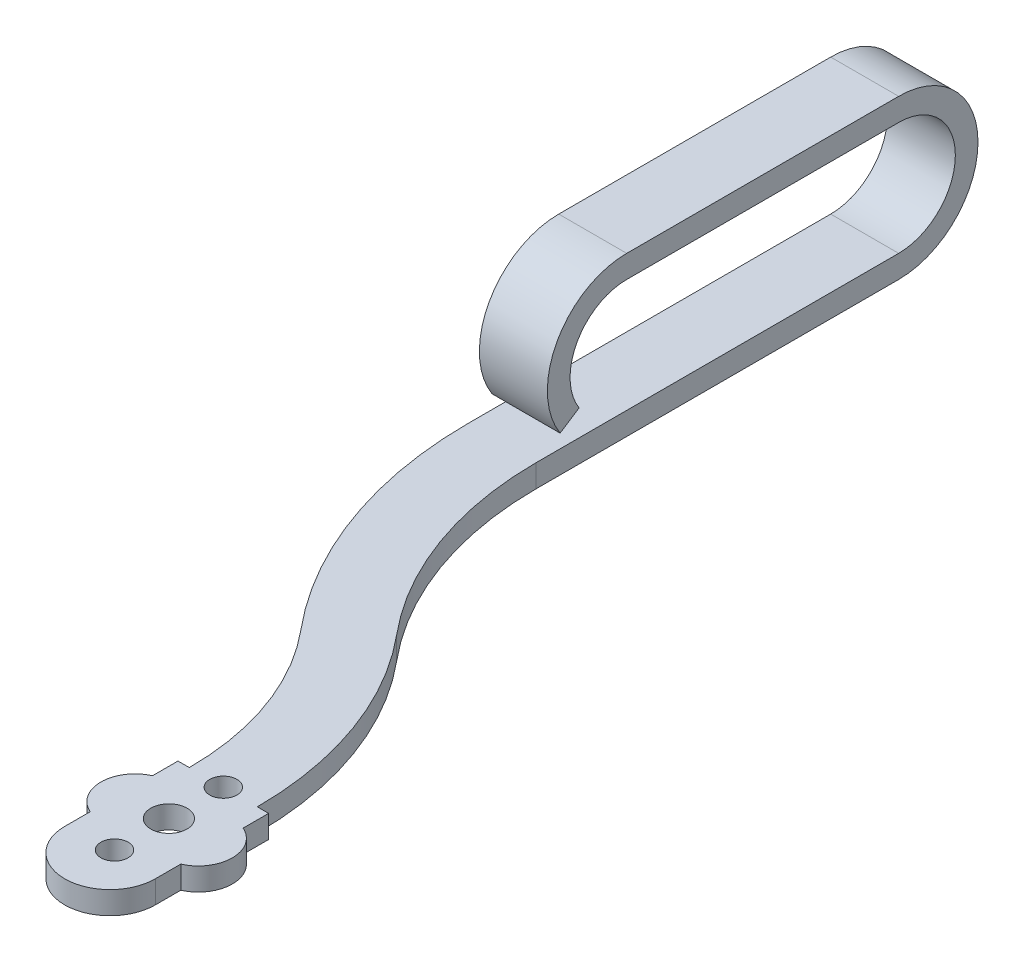
ISO-10303-21;
HEADER;
FILE_DESCRIPTION(('STEP AP214'),'2;1');
FILE_NAME('part.step','',(''),(''),'','','');
FILE_SCHEMA(('AUTOMOTIVE_DESIGN { 1 0 10303 214 1 1 1 1 }'));
ENDSEC;
DATA;
#1=APPLICATION_CONTEXT('core data for automotive mechanical design processes');
#2=APPLICATION_PROTOCOL_DEFINITION('international standard','automotive_design',2000,#1);
#3=PRODUCT_CONTEXT('',#1,'mechanical');
#4=PRODUCT('Part','Part','',(#3));
#5=PRODUCT_RELATED_PRODUCT_CATEGORY('part','',(#4));
#6=PRODUCT_DEFINITION_FORMATION('','',#4);
#7=PRODUCT_DEFINITION_CONTEXT('part definition',#1,'design');
#8=PRODUCT_DEFINITION('design','',#6,#7);
#9=PRODUCT_DEFINITION_SHAPE('','',#8);
#10=(LENGTH_UNIT() NAMED_UNIT(*) SI_UNIT(.MILLI.,.METRE.));
#11=(NAMED_UNIT(*) PLANE_ANGLE_UNIT() SI_UNIT($,.RADIAN.));
#12=(NAMED_UNIT(*) SI_UNIT($,.STERADIAN.) SOLID_ANGLE_UNIT());
#13=UNCERTAINTY_MEASURE_WITH_UNIT(LENGTH_MEASURE(1.E-05),#10,'distance_accuracy_value','');
#14=(GEOMETRIC_REPRESENTATION_CONTEXT(3) GLOBAL_UNCERTAINTY_ASSIGNED_CONTEXT((#13)) GLOBAL_UNIT_ASSIGNED_CONTEXT((#10,
#11,#12)) REPRESENTATION_CONTEXT('',''));
#15=CARTESIAN_POINT('',(0.,0.,0.));
#16=DIRECTION('',(0.,0.,1.));
#17=DIRECTION('',(1.,0.,0.));
#18=AXIS2_PLACEMENT_3D('',#15,#16,#17);
#19=CARTESIAN_POINT('',(0.,17.5,-20.));
#20=DIRECTION('',(1.,0.,0.));
#21=DIRECTION('',(0.,0.,-1.));
#22=AXIS2_PLACEMENT_3D('',#19,#20,#21);
#23=CYLINDRICAL_SURFACE('',#22,12.5);
#24=DIRECTION('',(1.,0.,0.));
#25=VECTOR('',#24,1.);
#26=CARTESIAN_POINT('',(7.5,30.,-19.9999999999998));
#27=LINE('',#26,#25);
#28=CARTESIAN_POINT('',(-7.5,30.,-19.9999999999998));
#29=VERTEX_POINT('',#28);
#30=CARTESIAN_POINT('',(7.5,30.,-19.9999999999998));
#31=VERTEX_POINT('',#30);
#32=EDGE_CURVE('E365',#29,#31,#27,.T.);
#33=ORIENTED_EDGE('',*,*,#32,.T.);
#34=CARTESIAN_POINT('',(7.5,17.5,-20.));
#35=DIRECTION('',(1.,0.,0.));
#36=DIRECTION('',(0.,0.,-1.));
#37=AXIS2_PLACEMENT_3D('',#34,#35,#36);
#38=CIRCLE('',#37,12.5);
#39=CARTESIAN_POINT('',(7.5,10.7142857142856,-9.50218681664362));
#40=VERTEX_POINT('',#39);
#41=EDGE_CURVE('E45',#31,#40,#38,.T.);
#42=ORIENTED_EDGE('',*,*,#41,.T.);
#43=DIRECTION('',(1.,0.,0.));
#44=VECTOR('',#43,1.);
#45=CARTESIAN_POINT('',(7.5,10.7142857142856,-9.50218681664362));
#46=LINE('',#45,#44);
#47=CARTESIAN_POINT('',(-7.5,10.7142857142856,-9.50218681664362));
#48=VERTEX_POINT('',#47);
#49=EDGE_CURVE('E53',#48,#40,#46,.T.);
#50=ORIENTED_EDGE('',*,*,#49,.F.);
#51=CARTESIAN_POINT('',(-7.5,17.5,-20.));
#52=DIRECTION('',(1.,0.,0.));
#53=DIRECTION('',(0.,0.,-1.));
#54=AXIS2_PLACEMENT_3D('',#51,#52,#53);
#55=CIRCLE('',#54,12.5);
#56=EDGE_CURVE('E11',#29,#48,#55,.T.);
#57=ORIENTED_EDGE('',*,*,#56,.F.);
#58=EDGE_LOOP('',(#33,#42,#50,#57));
#59=FACE_BOUND('',#58,.T.);
#60=ADVANCED_FACE('F37',(#59),#23,.F.);
#61=CARTESIAN_POINT('',(0.,17.5,-20.));
#62=DIRECTION('',(1.,0.,0.));
#63=DIRECTION('',(0.,0.,-1.));
#64=AXIS2_PLACEMENT_3D('',#61,#62,#63);
#65=CYLINDRICAL_SURFACE('',#64,17.5);
#66=DIRECTION('',(-1.,0.,0.));
#67=VECTOR('',#66,1.);
#68=CARTESIAN_POINT('',(7.5,35.,-19.9999999999998));
#69=LINE('',#68,#67);
#70=CARTESIAN_POINT('',(7.5,35.,-19.9999999999998));
#71=VERTEX_POINT('',#70);
#72=CARTESIAN_POINT('',(-7.5,35.,-19.9999999999998));
#73=VERTEX_POINT('',#72);
#74=EDGE_CURVE('E362',#71,#73,#69,.T.);
#75=ORIENTED_EDGE('',*,*,#74,.T.);
#76=CARTESIAN_POINT('',(-7.5,17.5,-20.));
#77=DIRECTION('',(1.,0.,0.));
#78=DIRECTION('',(0.,0.,-1.));
#79=AXIS2_PLACEMENT_3D('',#76,#77,#78);
#80=CIRCLE('',#79,17.5);
#81=CARTESIAN_POINT('',(-7.5,7.99999999999981,-5.30306154330106));
#82=VERTEX_POINT('',#81);
#83=EDGE_CURVE('E387',#73,#82,#80,.T.);
#84=ORIENTED_EDGE('',*,*,#83,.T.);
#85=DIRECTION('',(-1.,0.,0.));
#86=VECTOR('',#85,1.);
#87=CARTESIAN_POINT('',(7.5,7.9999999999998,-5.30306154330105));
#88=LINE('',#87,#86);
#89=CARTESIAN_POINT('',(7.5,7.9999999999998,-5.30306154330105));
#90=VERTEX_POINT('',#89);
#91=EDGE_CURVE('E382',#90,#82,#88,.T.);
#92=ORIENTED_EDGE('',*,*,#91,.F.);
#93=CARTESIAN_POINT('',(7.5,17.5,-20.));
#94=DIRECTION('',(1.,0.,0.));
#95=DIRECTION('',(0.,0.,-1.));
#96=AXIS2_PLACEMENT_3D('',#93,#94,#95);
#97=CIRCLE('',#96,17.5);
#98=EDGE_CURVE('E390',#71,#90,#97,.T.);
#99=ORIENTED_EDGE('',*,*,#98,.F.);
#100=EDGE_LOOP('',(#75,#84,#92,#99));
#101=FACE_BOUND('',#100,.T.);
#102=ADVANCED_FACE('F444',(#101),#65,.T.);
#103=CARTESIAN_POINT('',(7.5,30.,-79.9999999999998));
#104=DIRECTION('',(0.,-1.,0.));
#105=DIRECTION('',(1.,0.,0.));
#106=AXIS2_PLACEMENT_3D('',#103,#104,#105);
#107=PLANE('',#106);
#108=DIRECTION('',(1.,0.,0.));
#109=VECTOR('',#108,1.);
#110=CARTESIAN_POINT('',(7.5,30.,-79.9999999999998));
#111=LINE('',#110,#109);
#112=CARTESIAN_POINT('',(-7.5,30.,-79.9999999999998));
#113=VERTEX_POINT('',#112);
#114=CARTESIAN_POINT('',(7.5,30.,-79.9999999999998));
#115=VERTEX_POINT('',#114);
#116=EDGE_CURVE('E347',#113,#115,#111,.T.);
#117=ORIENTED_EDGE('',*,*,#116,.T.);
#118=DIRECTION('',(0.,0.,1.));
#119=VECTOR('',#118,1.);
#120=CARTESIAN_POINT('',(7.5,30.,-79.9999999999998));
#121=LINE('',#120,#119);
#122=EDGE_CURVE('E374',#115,#31,#121,.T.);
#123=ORIENTED_EDGE('',*,*,#122,.T.);
#124=ORIENTED_EDGE('',*,*,#32,.F.);
#125=DIRECTION('',(0.,0.,1.));
#126=VECTOR('',#125,1.);
#127=CARTESIAN_POINT('',(-7.5,30.,-79.9999999999998));
#128=LINE('',#127,#126);
#129=EDGE_CURVE('E377',#113,#29,#128,.T.);
#130=ORIENTED_EDGE('',*,*,#129,.F.);
#131=EDGE_LOOP('',(#117,#123,#124,#130));
#132=FACE_BOUND('',#131,.T.);
#133=ADVANCED_FACE('F449',(#132),#107,.T.);
#134=CARTESIAN_POINT('',(7.5,35.,-79.9999999999998));
#135=DIRECTION('',(0.,1.,0.));
#136=DIRECTION('',(-1.,0.,0.));
#137=AXIS2_PLACEMENT_3D('',#134,#135,#136);
#138=PLANE('',#137);
#139=DIRECTION('',(-1.,0.,0.));
#140=VECTOR('',#139,1.);
#141=CARTESIAN_POINT('',(7.5,35.,-79.9999999999998));
#142=LINE('',#141,#140);
#143=CARTESIAN_POINT('',(7.5,35.,-79.9999999999998));
#144=VERTEX_POINT('',#143);
#145=CARTESIAN_POINT('',(-7.5,35.,-79.9999999999998));
#146=VERTEX_POINT('',#145);
#147=EDGE_CURVE('E344',#144,#146,#142,.T.);
#148=ORIENTED_EDGE('',*,*,#147,.T.);
#149=DIRECTION('',(0.,0.,1.));
#150=VECTOR('',#149,1.);
#151=CARTESIAN_POINT('',(-7.5,35.,-79.9999999999998));
#152=LINE('',#151,#150);
#153=EDGE_CURVE('E368',#146,#73,#152,.T.);
#154=ORIENTED_EDGE('',*,*,#153,.T.);
#155=ORIENTED_EDGE('',*,*,#74,.F.);
#156=DIRECTION('',(0.,0.,1.));
#157=VECTOR('',#156,1.);
#158=CARTESIAN_POINT('',(7.5,35.,-79.9999999999998));
#159=LINE('',#158,#157);
#160=EDGE_CURVE('E371',#144,#71,#159,.T.);
#161=ORIENTED_EDGE('',*,*,#160,.F.);
#162=EDGE_LOOP('',(#148,#154,#155,#161));
#163=FACE_BOUND('',#162,.T.);
#164=ADVANCED_FACE('F442',(#163),#138,.T.);
#165=CARTESIAN_POINT('',(0.,17.5,-80.));
#166=DIRECTION('',(1.,0.,0.));
#167=DIRECTION('',(0.,0.,-1.));
#168=AXIS2_PLACEMENT_3D('',#165,#166,#167);
#169=CYLINDRICAL_SURFACE('',#168,12.5);
#170=DIRECTION('',(1.,0.,0.));
#171=VECTOR('',#170,1.);
#172=CARTESIAN_POINT('',(7.5,4.99999999999998,-80.));
#173=LINE('',#172,#171);
#174=CARTESIAN_POINT('',(-7.5,4.99999999999999,-80.));
#175=VERTEX_POINT('',#174);
#176=CARTESIAN_POINT('',(7.5,4.99999999999998,-80.));
#177=VERTEX_POINT('',#176);
#178=EDGE_CURVE('E321',#175,#177,#173,.T.);
#179=ORIENTED_EDGE('',*,*,#178,.T.);
#180=CARTESIAN_POINT('',(7.5,17.5,-80.));
#181=DIRECTION('',(1.,0.,0.));
#182=DIRECTION('',(0.,0.,-1.));
#183=AXIS2_PLACEMENT_3D('',#180,#181,#182);
#184=CIRCLE('',#183,12.5);
#185=EDGE_CURVE('E356',#177,#115,#184,.T.);
#186=ORIENTED_EDGE('',*,*,#185,.T.);
#187=ORIENTED_EDGE('',*,*,#116,.F.);
#188=CARTESIAN_POINT('',(-7.5,17.5,-80.));
#189=DIRECTION('',(1.,0.,0.));
#190=DIRECTION('',(0.,0.,-1.));
#191=AXIS2_PLACEMENT_3D('',#188,#189,#190);
#192=CIRCLE('',#191,12.5);
#193=EDGE_CURVE('E359',#175,#113,#192,.T.);
#194=ORIENTED_EDGE('',*,*,#193,.F.);
#195=EDGE_LOOP('',(#179,#186,#187,#194));
#196=FACE_BOUND('',#195,.T.);
#197=ADVANCED_FACE('F432',(#196),#169,.F.);
#198=CARTESIAN_POINT('',(0.,17.5,-80.));
#199=DIRECTION('',(1.,0.,0.));
#200=DIRECTION('',(0.,0.,-1.));
#201=AXIS2_PLACEMENT_3D('',#198,#199,#200);
#202=CYLINDRICAL_SURFACE('',#201,17.5);
#203=DIRECTION('',(-1.,0.,0.));
#204=VECTOR('',#203,1.);
#205=CARTESIAN_POINT('',(7.5,0.,-80.));
#206=LINE('',#205,#204);
#207=CARTESIAN_POINT('',(7.5,0.,-80.));
#208=VERTEX_POINT('',#207);
#209=CARTESIAN_POINT('',(-7.5,0.,-80.));
#210=VERTEX_POINT('',#209);
#211=EDGE_CURVE('E324',#208,#210,#206,.T.);
#212=ORIENTED_EDGE('',*,*,#211,.T.);
#213=CARTESIAN_POINT('',(-7.5,17.5,-80.));
#214=DIRECTION('',(1.,0.,0.));
#215=DIRECTION('',(0.,0.,-1.));
#216=AXIS2_PLACEMENT_3D('',#213,#214,#215);
#217=CIRCLE('',#216,17.5);
#218=EDGE_CURVE('E350',#210,#146,#217,.T.);
#219=ORIENTED_EDGE('',*,*,#218,.T.);
#220=ORIENTED_EDGE('',*,*,#147,.F.);
#221=CARTESIAN_POINT('',(7.5,17.5,-80.));
#222=DIRECTION('',(1.,0.,0.));
#223=DIRECTION('',(0.,0.,-1.));
#224=AXIS2_PLACEMENT_3D('',#221,#222,#223);
#225=CIRCLE('',#224,17.5);
#226=EDGE_CURVE('E353',#208,#144,#225,.T.);
#227=ORIENTED_EDGE('',*,*,#226,.F.);
#228=EDGE_LOOP('',(#212,#219,#220,#227));
#229=FACE_BOUND('',#228,.T.);
#230=ADVANCED_FACE('F438',(#229),#202,.T.);
#231=CARTESIAN_POINT('',(-7.5,0.,-80.));
#232=DIRECTION('',(1.,0.,0.));
#233=DIRECTION('',(0.,1.,0.));
#234=AXIS2_PLACEMENT_3D('',#231,#232,#233);
#235=PLANE('',#234);
#236=DIRECTION('',(0.,1.,0.));
#237=VECTOR('',#236,1.);
#238=CARTESIAN_POINT('',(-7.5,0.,0.));
#239=LINE('',#238,#237);
#240=CARTESIAN_POINT('',(-7.5,0.,0.));
#241=VERTEX_POINT('',#240);
#242=CARTESIAN_POINT('',(-7.5,5.,0.));
#243=VERTEX_POINT('',#242);
#244=EDGE_CURVE('E329',#241,#243,#239,.T.);
#245=ORIENTED_EDGE('',*,*,#244,.T.);
#246=DIRECTION('',(0.,0.,1.));
#247=VECTOR('',#246,1.);
#248=CARTESIAN_POINT('',(-7.5,4.99999999999999,-80.));
#249=LINE('',#248,#247);
#250=EDGE_CURVE('E342',#175,#243,#249,.T.);
#251=ORIENTED_EDGE('',*,*,#250,.F.);
#252=ORIENTED_EDGE('',*,*,#193,.T.);
#253=ORIENTED_EDGE('',*,*,#129,.T.);
#254=ORIENTED_EDGE('',*,*,#56,.T.);
#255=DIRECTION('',(0.,0.542857142857154,-0.839825054668511));
#256=VECTOR('',#255,1.);
#257=CARTESIAN_POINT('',(-7.5,7.99999999999981,-5.30306154330106));
#258=LINE('',#257,#256);
#259=EDGE_CURVE('E380',#82,#48,#258,.T.);
#260=ORIENTED_EDGE('',*,*,#259,.F.);
#261=ORIENTED_EDGE('',*,*,#83,.F.);
#262=ORIENTED_EDGE('',*,*,#153,.F.);
#263=ORIENTED_EDGE('',*,*,#218,.F.);
#264=DIRECTION('',(0.,0.,1.));
#265=VECTOR('',#264,1.);
#266=CARTESIAN_POINT('',(-7.5,0.,-80.));
#267=LINE('',#266,#265);
#268=EDGE_CURVE('E328',#210,#241,#267,.T.);
#269=ORIENTED_EDGE('',*,*,#268,.T.);
#270=EDGE_LOOP('',(#245,#251,#252,#253,#254,#260,#261,#262,#263,#269));
#271=FACE_BOUND('',#270,.T.);
#272=ADVANCED_FACE('F435',(#271),#235,.F.);
#273=CARTESIAN_POINT('',(7.5,4.99999999999998,-80.));
#274=DIRECTION('',(0.,-1.,0.));
#275=DIRECTION('',(0.,0.,-1.));
#276=AXIS2_PLACEMENT_3D('',#273,#274,#275);
#277=PLANE('',#276);
#278=CARTESIAN_POINT('',(35.,5.00000000000002,96.4999999999999));
#279=DIRECTION('',(0.,1.,0.));
#280=DIRECTION('',(0.,0.,1.));
#281=AXIS2_PLACEMENT_3D('',#278,#279,#280);
#282=CIRCLE('',#281,3.);
#283=CARTESIAN_POINT('',(35.,5.00000000000002,99.4999999999999));
#284=VERTEX_POINT('',#283);
#285=EDGE_CURVE('E682',#284,#284,#282,.T.);
#286=ORIENTED_EDGE('',*,*,#285,.F.);
#287=EDGE_LOOP('',(#286));
#288=FACE_BOUND('',#287,.T.);
#289=ORIENTED_EDGE('',*,*,#250,.T.);
#290=CARTESIAN_POINT('',(82.7660714285714,4.99999999999999,0.));
#291=DIRECTION('',(0.,-1.,0.));
#292=DIRECTION('',(0.,0.,-1.));
#293=AXIS2_PLACEMENT_3D('',#290,#291,#292);
#294=CIRCLE('',#293,90.2660714285714);
#295=CARTESIAN_POINT('',(13.4876272272177,5.00000000000001,57.8658864979003));
#296=VERTEX_POINT('',#295);
#297=EDGE_CURVE('E307',#296,#243,#294,.T.);
#298=ORIENTED_EDGE('',*,*,#297,.F.);
#299=CARTESIAN_POINT('',(-32.7660714285715,5.00000000000003,96.5));
#300=DIRECTION('',(0.,-1.,0.));
#301=DIRECTION('',(0.,0.,-1.));
#302=AXIS2_PLACEMENT_3D('',#299,#300,#301);
#303=CIRCLE('',#302,60.2660714285715);
#304=CARTESIAN_POINT('',(27.5,5.00000000000002,96.4999999999999));
#305=VERTEX_POINT('',#304);
#306=EDGE_CURVE('E332',#296,#305,#303,.T.);
#307=ORIENTED_EDGE('',*,*,#306,.T.);
#308=DIRECTION('',(1.,0.,0.));
#309=VECTOR('',#308,1.);
#310=CARTESIAN_POINT('',(25.,5.00000000000002,96.4999999999999));
#311=LINE('',#310,#309);
#312=CARTESIAN_POINT('',(25.,5.00000000000002,96.4999999999999));
#313=VERTEX_POINT('',#312);
#314=EDGE_CURVE('E199',#313,#305,#311,.T.);
#315=ORIENTED_EDGE('',*,*,#314,.F.);
#316=DIRECTION('',(0.,0.,-1.));
#317=VECTOR('',#316,1.);
#318=CARTESIAN_POINT('',(25.,5.00000000000002,102.126136457566));
#319=LINE('',#318,#317);
#320=CARTESIAN_POINT('',(25.,5.00000000000002,102.126136457566));
#321=VERTEX_POINT('',#320);
#322=EDGE_CURVE('E236',#321,#313,#319,.T.);
#323=ORIENTED_EDGE('',*,*,#322,.F.);
#324=CARTESIAN_POINT('',(28.,5.00000000000002,109.));
#325=DIRECTION('',(0.,-1.,0.));
#326=DIRECTION('',(0.,0.,-1.));
#327=AXIS2_PLACEMENT_3D('',#324,#325,#326);
#328=CIRCLE('',#327,7.5);
#329=CARTESIAN_POINT('',(25.,5.00000000000002,115.873863542434));
#330=VERTEX_POINT('',#329);
#331=EDGE_CURVE('E233',#330,#321,#328,.T.);
#332=ORIENTED_EDGE('',*,*,#331,.F.);
#333=DIRECTION('',(0.,0.,-1.));
#334=VECTOR('',#333,1.);
#335=CARTESIAN_POINT('',(25.,5.00000000000002,115.873863542434));
#336=LINE('',#335,#334);
#337=CARTESIAN_POINT('',(25.,5.00000000000002,121.5));
#338=VERTEX_POINT('',#337);
#339=EDGE_CURVE('E230',#338,#330,#336,.T.);
#340=ORIENTED_EDGE('',*,*,#339,.F.);
#341=CARTESIAN_POINT('',(35.,5.00000000000002,121.5));
#342=DIRECTION('',(0.,-1.,0.));
#343=DIRECTION('',(0.,0.,1.));
#344=AXIS2_PLACEMENT_3D('',#341,#342,#343);
#345=CIRCLE('',#344,10.);
#346=CARTESIAN_POINT('',(45.,5.00000000000002,121.5));
#347=VERTEX_POINT('',#346);
#348=EDGE_CURVE('E227',#347,#338,#345,.T.);
#349=ORIENTED_EDGE('',*,*,#348,.F.);
#350=DIRECTION('',(0.,0.,1.));
#351=VECTOR('',#350,1.);
#352=CARTESIAN_POINT('',(45.,5.00000000000002,121.5));
#353=LINE('',#352,#351);
#354=CARTESIAN_POINT('',(45.,5.00000000000002,115.873863542434));
#355=VERTEX_POINT('',#354);
#356=EDGE_CURVE('E211',#355,#347,#353,.T.);
#357=ORIENTED_EDGE('',*,*,#356,.F.);
#358=CARTESIAN_POINT('',(42.,5.00000000000002,109.));
#359=DIRECTION('',(0.,-1.,0.));
#360=DIRECTION('',(0.,0.,-1.));
#361=AXIS2_PLACEMENT_3D('',#358,#359,#360);
#362=CIRCLE('',#361,7.5);
#363=CARTESIAN_POINT('',(45.,5.00000000000002,102.126136457566));
#364=VERTEX_POINT('',#363);
#365=EDGE_CURVE('E191',#364,#355,#362,.T.);
#366=ORIENTED_EDGE('',*,*,#365,.F.);
#367=DIRECTION('',(0.,0.,1.));
#368=VECTOR('',#367,1.);
#369=CARTESIAN_POINT('',(45.,5.00000000000001,96.4999999999999));
#370=LINE('',#369,#368);
#371=CARTESIAN_POINT('',(45.,5.00000000000001,96.4999999999999));
#372=VERTEX_POINT('',#371);
#373=EDGE_CURVE('E208',#372,#364,#370,.T.);
#374=ORIENTED_EDGE('',*,*,#373,.F.);
#375=CARTESIAN_POINT('',(42.5,5.00000000000001,96.4999999999999));
#376=VERTEX_POINT('',#375);
#377=EDGE_CURVE('E239',#376,#372,#311,.T.);
#378=ORIENTED_EDGE('',*,*,#377,.F.);
#379=CARTESIAN_POINT('',(-32.7660714285715,5.00000000000003,96.5));
#380=DIRECTION('',(0.,-1.,0.));
#381=DIRECTION('',(0.,0.,-1.));
#382=AXIS2_PLACEMENT_3D('',#379,#380,#381);
#383=CIRCLE('',#382,75.2660714285715);
#384=CARTESIAN_POINT('',(25.,5.00000000000001,48.25));
#385=VERTEX_POINT('',#384);
#386=EDGE_CURVE('E301',#385,#376,#383,.T.);
#387=ORIENTED_EDGE('',*,*,#386,.F.);
#388=CARTESIAN_POINT('',(82.7660714285714,4.99999999999999,0.));
#389=DIRECTION('',(0.,-1.,0.));
#390=DIRECTION('',(0.,0.,-1.));
#391=AXIS2_PLACEMENT_3D('',#388,#389,#390);
#392=CIRCLE('',#391,75.2660714285714);
#393=CARTESIAN_POINT('',(7.5,5.,0.));
#394=VERTEX_POINT('',#393);
#395=EDGE_CURVE('E414',#385,#394,#392,.T.);
#396=ORIENTED_EDGE('',*,*,#395,.T.);
#397=DIRECTION('',(0.,0.,1.));
#398=VECTOR('',#397,1.);
#399=CARTESIAN_POINT('',(7.5,4.99999999999998,-80.));
#400=LINE('',#399,#398);
#401=EDGE_CURVE('E339',#177,#394,#400,.T.);
#402=ORIENTED_EDGE('',*,*,#401,.F.);
#403=ORIENTED_EDGE('',*,*,#178,.F.);
#404=EDGE_LOOP('',(#289,#298,#307,#315,#323,#332,#340,#349,#357,#366,#374,#378,#387,#396,#402,#403));
#405=FACE_BOUND('',#404,.T.);
#406=CARTESIAN_POINT('',(35.,5.00000000000002,120.5));
#407=DIRECTION('',(0.,-1.,0.));
#408=DIRECTION('',(0.,0.,-1.));
#409=AXIS2_PLACEMENT_3D('',#406,#407,#408);
#410=CIRCLE('',#409,3.00000000000001);
#411=CARTESIAN_POINT('',(35.,5.00000000000002,117.5));
#412=VERTEX_POINT('',#411);
#413=EDGE_CURVE('E687',#412,#412,#410,.T.);
#414=ORIENTED_EDGE('',*,*,#413,.T.);
#415=EDGE_LOOP('',(#414));
#416=FACE_BOUND('',#415,.T.);
#417=CARTESIAN_POINT('',(35.,5.00000000000002,108.5));
#418=DIRECTION('',(0.,-1.,0.));
#419=DIRECTION('',(0.,0.,-1.));
#420=AXIS2_PLACEMENT_3D('',#417,#418,#419);
#421=CIRCLE('',#420,4.00000000000002);
#422=CARTESIAN_POINT('',(35.,5.00000000000002,104.5));
#423=VERTEX_POINT('',#422);
#424=EDGE_CURVE('E282',#423,#423,#421,.T.);
#425=ORIENTED_EDGE('',*,*,#424,.T.);
#426=EDGE_LOOP('',(#425));
#427=FACE_BOUND('',#426,.T.);
#428=ADVANCED_FACE('F205',(#288,#405,#416,#427),#277,.F.);
#429=CARTESIAN_POINT('',(7.5,0.,-80.));
#430=DIRECTION('',(-1.,0.,0.));
#431=DIRECTION('',(0.,-1.,0.));
#432=AXIS2_PLACEMENT_3D('',#429,#430,#431);
#433=PLANE('',#432);
#434=DIRECTION('',(0.,-1.,0.));
#435=VECTOR('',#434,1.);
#436=CARTESIAN_POINT('',(7.5,0.,0.));
#437=LINE('',#436,#435);
#438=CARTESIAN_POINT('',(7.5,0.,0.));
#439=VERTEX_POINT('',#438);
#440=EDGE_CURVE('E325',#394,#439,#437,.T.);
#441=ORIENTED_EDGE('',*,*,#440,.T.);
#442=DIRECTION('',(0.,0.,1.));
#443=VECTOR('',#442,1.);
#444=CARTESIAN_POINT('',(7.5,0.,-80.));
#445=LINE('',#444,#443);
#446=EDGE_CURVE('E337',#208,#439,#445,.T.);
#447=ORIENTED_EDGE('',*,*,#446,.F.);
#448=ORIENTED_EDGE('',*,*,#226,.T.);
#449=ORIENTED_EDGE('',*,*,#160,.T.);
#450=ORIENTED_EDGE('',*,*,#98,.T.);
#451=DIRECTION('',(0.,-0.542857142857154,0.839825054668511));
#452=VECTOR('',#451,1.);
#453=CARTESIAN_POINT('',(7.5,7.9999999999998,-5.30306154330105));
#454=LINE('',#453,#452);
#455=EDGE_CURVE('E61',#40,#90,#454,.T.);
#456=ORIENTED_EDGE('',*,*,#455,.F.);
#457=ORIENTED_EDGE('',*,*,#41,.F.);
#458=ORIENTED_EDGE('',*,*,#122,.F.);
#459=ORIENTED_EDGE('',*,*,#185,.F.);
#460=ORIENTED_EDGE('',*,*,#401,.T.);
#461=EDGE_LOOP('',(#441,#447,#448,#449,#450,#456,#457,#458,#459,#460));
#462=FACE_BOUND('',#461,.T.);
#463=ADVANCED_FACE('F428',(#462),#433,.F.);
#464=CARTESIAN_POINT('',(7.5,0.,-80.));
#465=DIRECTION('',(0.,1.,0.));
#466=DIRECTION('',(0.,0.,1.));
#467=AXIS2_PLACEMENT_3D('',#464,#465,#466);
#468=PLANE('',#467);
#469=CARTESIAN_POINT('',(35.,0.,96.4999999999999));
#470=DIRECTION('',(0.,1.,0.));
#471=DIRECTION('',(0.,0.,1.));
#472=AXIS2_PLACEMENT_3D('',#469,#470,#471);
#473=CIRCLE('',#472,3.);
#474=CARTESIAN_POINT('',(35.,0.,99.4999999999999));
#475=VERTEX_POINT('',#474);
#476=EDGE_CURVE('E40',#475,#475,#473,.T.);
#477=ORIENTED_EDGE('',*,*,#476,.T.);
#478=EDGE_LOOP('',(#477));
#479=FACE_BOUND('',#478,.T.);
#480=ORIENTED_EDGE('',*,*,#446,.T.);
#481=CARTESIAN_POINT('',(82.7660714285714,0.,0.));
#482=DIRECTION('',(0.,-1.,0.));
#483=DIRECTION('',(0.,0.,-1.));
#484=AXIS2_PLACEMENT_3D('',#481,#482,#483);
#485=CIRCLE('',#484,75.2660714285714);
#486=CARTESIAN_POINT('',(25.,0.,48.25));
#487=VERTEX_POINT('',#486);
#488=EDGE_CURVE('E412',#487,#439,#485,.T.);
#489=ORIENTED_EDGE('',*,*,#488,.F.);
#490=CARTESIAN_POINT('',(-32.7660714285715,0.,96.5));
#491=DIRECTION('',(0.,-1.,0.));
#492=DIRECTION('',(0.,0.,-1.));
#493=AXIS2_PLACEMENT_3D('',#490,#491,#492);
#494=CIRCLE('',#493,75.2660714285715);
#495=CARTESIAN_POINT('',(42.5,0.,96.4999999999999));
#496=VERTEX_POINT('',#495);
#497=EDGE_CURVE('E304',#487,#496,#494,.T.);
#498=ORIENTED_EDGE('',*,*,#497,.T.);
#499=DIRECTION('',(1.,0.,0.));
#500=VECTOR('',#499,1.);
#501=CARTESIAN_POINT('',(25.,0.,96.4999999999999));
#502=LINE('',#501,#500);
#503=CARTESIAN_POINT('',(45.,0.,96.4999999999999));
#504=VERTEX_POINT('',#503);
#505=EDGE_CURVE('E220',#496,#504,#502,.T.);
#506=ORIENTED_EDGE('',*,*,#505,.T.);
#507=DIRECTION('',(0.,0.,1.));
#508=VECTOR('',#507,1.);
#509=CARTESIAN_POINT('',(45.,0.,96.4999999999999));
#510=LINE('',#509,#508);
#511=CARTESIAN_POINT('',(45.,0.,102.126136457566));
#512=VERTEX_POINT('',#511);
#513=EDGE_CURVE('E242',#504,#512,#510,.T.);
#514=ORIENTED_EDGE('',*,*,#513,.T.);
#515=CARTESIAN_POINT('',(42.,0.,109.));
#516=DIRECTION('',(0.,-1.,0.));
#517=DIRECTION('',(0.,0.,-1.));
#518=AXIS2_PLACEMENT_3D('',#515,#516,#517);
#519=CIRCLE('',#518,7.5);
#520=CARTESIAN_POINT('',(45.,0.,115.873863542434));
#521=VERTEX_POINT('',#520);
#522=EDGE_CURVE('E193',#512,#521,#519,.T.);
#523=ORIENTED_EDGE('',*,*,#522,.T.);
#524=DIRECTION('',(0.,0.,1.));
#525=VECTOR('',#524,1.);
#526=CARTESIAN_POINT('',(45.,0.,121.5));
#527=LINE('',#526,#525);
#528=CARTESIAN_POINT('',(45.,0.,121.5));
#529=VERTEX_POINT('',#528);
#530=EDGE_CURVE('E272',#521,#529,#527,.T.);
#531=ORIENTED_EDGE('',*,*,#530,.T.);
#532=CARTESIAN_POINT('',(35.,0.,121.5));
#533=DIRECTION('',(0.,-1.,0.));
#534=DIRECTION('',(0.,0.,1.));
#535=AXIS2_PLACEMENT_3D('',#532,#533,#534);
#536=CIRCLE('',#535,10.);
#537=CARTESIAN_POINT('',(25.,0.,121.5));
#538=VERTEX_POINT('',#537);
#539=EDGE_CURVE('E277',#529,#538,#536,.T.);
#540=ORIENTED_EDGE('',*,*,#539,.T.);
#541=DIRECTION('',(0.,0.,-1.));
#542=VECTOR('',#541,1.);
#543=CARTESIAN_POINT('',(25.,0.,115.873863542434));
#544=LINE('',#543,#542);
#545=CARTESIAN_POINT('',(25.,0.,115.873863542434));
#546=VERTEX_POINT('',#545);
#547=EDGE_CURVE('E285',#538,#546,#544,.T.);
#548=ORIENTED_EDGE('',*,*,#547,.T.);
#549=CARTESIAN_POINT('',(28.,0.,109.));
#550=DIRECTION('',(0.,-1.,0.));
#551=DIRECTION('',(0.,0.,-1.));
#552=AXIS2_PLACEMENT_3D('',#549,#550,#551);
#553=CIRCLE('',#552,7.5);
#554=CARTESIAN_POINT('',(25.,0.,102.126136457566));
#555=VERTEX_POINT('',#554);
#556=EDGE_CURVE('E287',#546,#555,#553,.T.);
#557=ORIENTED_EDGE('',*,*,#556,.T.);
#558=DIRECTION('',(0.,0.,-1.));
#559=VECTOR('',#558,1.);
#560=CARTESIAN_POINT('',(25.,0.,102.126136457566));
#561=LINE('',#560,#559);
#562=CARTESIAN_POINT('',(25.,0.,96.4999999999999));
#563=VERTEX_POINT('',#562);
#564=EDGE_CURVE('E251',#555,#563,#561,.T.);
#565=ORIENTED_EDGE('',*,*,#564,.T.);
#566=CARTESIAN_POINT('',(27.5,0.,96.4999999999999));
#567=VERTEX_POINT('',#566);
#568=EDGE_CURVE('E217',#563,#567,#502,.T.);
#569=ORIENTED_EDGE('',*,*,#568,.T.);
#570=CARTESIAN_POINT('',(-32.7660714285715,0.,96.5));
#571=DIRECTION('',(0.,-1.,0.));
#572=DIRECTION('',(0.,0.,-1.));
#573=AXIS2_PLACEMENT_3D('',#570,#571,#572);
#574=CIRCLE('',#573,60.2660714285715);
#575=CARTESIAN_POINT('',(13.4876272272177,0.,57.8658864979003));
#576=VERTEX_POINT('',#575);
#577=EDGE_CURVE('E314',#576,#567,#574,.T.);
#578=ORIENTED_EDGE('',*,*,#577,.F.);
#579=CARTESIAN_POINT('',(82.7660714285714,0.,0.));
#580=DIRECTION('',(0.,-1.,0.));
#581=DIRECTION('',(0.,0.,-1.));
#582=AXIS2_PLACEMENT_3D('',#579,#580,#581);
#583=CIRCLE('',#582,90.2660714285714);
#584=EDGE_CURVE('E409',#576,#241,#583,.T.);
#585=ORIENTED_EDGE('',*,*,#584,.T.);
#586=ORIENTED_EDGE('',*,*,#268,.F.);
#587=ORIENTED_EDGE('',*,*,#211,.F.);
#588=EDGE_LOOP('',(#480,#489,#498,#506,#514,#523,#531,#540,#548,#557,#565,#569,#578,#585,#586,#587));
#589=FACE_BOUND('',#588,.T.);
#590=CARTESIAN_POINT('',(35.,0.,120.5));
#591=DIRECTION('',(0.,-1.,0.));
#592=DIRECTION('',(0.,0.,-1.));
#593=AXIS2_PLACEMENT_3D('',#590,#591,#592);
#594=CIRCLE('',#593,3.00000000000001);
#595=CARTESIAN_POINT('',(35.,0.,117.5));
#596=VERTEX_POINT('',#595);
#597=EDGE_CURVE('E685',#596,#596,#594,.T.);
#598=ORIENTED_EDGE('',*,*,#597,.F.);
#599=EDGE_LOOP('',(#598));
#600=FACE_BOUND('',#599,.T.);
#601=CARTESIAN_POINT('',(35.,0.,108.5));
#602=DIRECTION('',(0.,-1.,0.));
#603=DIRECTION('',(0.,0.,-1.));
#604=AXIS2_PLACEMENT_3D('',#601,#602,#603);
#605=CIRCLE('',#604,4.00000000000002);
#606=CARTESIAN_POINT('',(35.,0.,104.5));
#607=VERTEX_POINT('',#606);
#608=EDGE_CURVE('E223',#607,#607,#605,.T.);
#609=ORIENTED_EDGE('',*,*,#608,.F.);
#610=EDGE_LOOP('',(#609));
#611=FACE_BOUND('',#610,.T.);
#612=ADVANCED_FACE('F280',(#479,#589,#600,#611),#468,.F.);
#613=CARTESIAN_POINT('',(0.,7.9999999999998,-5.30306154330105));
#614=DIRECTION('',(0.,0.839825054668511,0.542857142857154));
#615=DIRECTION('',(1.,0.,0.));
#616=AXIS2_PLACEMENT_3D('',#613,#614,#615);
#617=PLANE('',#616);
#618=ORIENTED_EDGE('',*,*,#259,.T.);
#619=ORIENTED_EDGE('',*,*,#49,.T.);
#620=ORIENTED_EDGE('',*,*,#455,.T.);
#621=ORIENTED_EDGE('',*,*,#91,.T.);
#622=EDGE_LOOP('',(#618,#619,#620,#621));
#623=FACE_BOUND('',#622,.T.);
#624=ADVANCED_FACE('F446',(#623),#617,.F.);
#625=CARTESIAN_POINT('',(-32.7660714285715,0.,96.5));
#626=DIRECTION('',(0.,-1.,0.));
#627=DIRECTION('',(0.,0.,-1.));
#628=AXIS2_PLACEMENT_3D('',#625,#626,#627);
#629=CYLINDRICAL_SURFACE('',#628,60.2660714285715);
#630=DIRECTION('',(0.,-1.,0.));
#631=VECTOR('',#630,1.);
#632=CARTESIAN_POINT('',(13.4876272272177,5.00000000000001,57.8658864979003));
#633=LINE('',#632,#631);
#634=EDGE_CURVE('E258',#296,#576,#633,.T.);
#635=ORIENTED_EDGE('',*,*,#634,.T.);
#636=ORIENTED_EDGE('',*,*,#577,.T.);
#637=DIRECTION('',(0.,-1.,0.));
#638=VECTOR('',#637,1.);
#639=CARTESIAN_POINT('',(27.5,5.00000000000002,96.4999999999999));
#640=LINE('',#639,#638);
#641=EDGE_CURVE('E297',#305,#567,#640,.T.);
#642=ORIENTED_EDGE('',*,*,#641,.F.);
#643=ORIENTED_EDGE('',*,*,#306,.F.);
#644=EDGE_LOOP('',(#635,#636,#642,#643));
#645=FACE_BOUND('',#644,.T.);
#646=ADVANCED_FACE('F404',(#645),#629,.F.);
#647=CARTESIAN_POINT('',(-32.7660714285715,0.,96.5));
#648=DIRECTION('',(0.,-1.,0.));
#649=DIRECTION('',(0.,0.,-1.));
#650=AXIS2_PLACEMENT_3D('',#647,#648,#649);
#651=CYLINDRICAL_SURFACE('',#650,75.2660714285715);
#652=DIRECTION('',(0.,1.,0.));
#653=VECTOR('',#652,1.);
#654=CARTESIAN_POINT('',(25.,0.,48.25));
#655=LINE('',#654,#653);
#656=EDGE_CURVE('E407',#487,#385,#655,.T.);
#657=ORIENTED_EDGE('',*,*,#656,.T.);
#658=ORIENTED_EDGE('',*,*,#386,.T.);
#659=DIRECTION('',(0.,1.,0.));
#660=VECTOR('',#659,1.);
#661=CARTESIAN_POINT('',(42.5,0.,96.4999999999999));
#662=LINE('',#661,#660);
#663=EDGE_CURVE('E302',#496,#376,#662,.T.);
#664=ORIENTED_EDGE('',*,*,#663,.F.);
#665=ORIENTED_EDGE('',*,*,#497,.F.);
#666=EDGE_LOOP('',(#657,#658,#664,#665));
#667=FACE_BOUND('',#666,.T.);
#668=ADVANCED_FACE('F423',(#667),#651,.T.);
#669=CARTESIAN_POINT('',(82.7660714285714,0.,0.));
#670=DIRECTION('',(0.,-1.,0.));
#671=DIRECTION('',(0.,0.,-1.));
#672=AXIS2_PLACEMENT_3D('',#669,#670,#671);
#673=CYLINDRICAL_SURFACE('',#672,90.2660714285714);
#674=ORIENTED_EDGE('',*,*,#584,.F.);
#675=ORIENTED_EDGE('',*,*,#634,.F.);
#676=ORIENTED_EDGE('',*,*,#297,.T.);
#677=ORIENTED_EDGE('',*,*,#244,.F.);
#678=EDGE_LOOP('',(#674,#675,#676,#677));
#679=FACE_BOUND('',#678,.T.);
#680=ADVANCED_FACE('F410',(#679),#673,.T.);
#681=CARTESIAN_POINT('',(82.7660714285714,0.,0.));
#682=DIRECTION('',(0.,-1.,0.));
#683=DIRECTION('',(0.,0.,-1.));
#684=AXIS2_PLACEMENT_3D('',#681,#682,#683);
#685=CYLINDRICAL_SURFACE('',#684,75.2660714285714);
#686=ORIENTED_EDGE('',*,*,#656,.F.);
#687=ORIENTED_EDGE('',*,*,#488,.T.);
#688=ORIENTED_EDGE('',*,*,#440,.F.);
#689=ORIENTED_EDGE('',*,*,#395,.F.);
#690=EDGE_LOOP('',(#686,#687,#688,#689));
#691=FACE_BOUND('',#690,.T.);
#692=ADVANCED_FACE('F425',(#691),#685,.F.);
#693=CARTESIAN_POINT('',(25.,5.00000000000002,96.4999999999999));
#694=DIRECTION('',(0.,0.,-1.));
#695=DIRECTION('',(0.,1.,0.));
#696=AXIS2_PLACEMENT_3D('',#693,#694,#695);
#697=PLANE('',#696);
#698=ORIENTED_EDGE('',*,*,#314,.T.);
#699=ORIENTED_EDGE('',*,*,#641,.T.);
#700=ORIENTED_EDGE('',*,*,#568,.F.);
#701=DIRECTION('',(0.,-1.,0.));
#702=VECTOR('',#701,1.);
#703=CARTESIAN_POINT('',(25.,5.00000000000002,96.4999999999999));
#704=LINE('',#703,#702);
#705=EDGE_CURVE('E259',#313,#563,#704,.T.);
#706=ORIENTED_EDGE('',*,*,#705,.F.);
#707=EDGE_LOOP('',(#698,#699,#700,#706));
#708=FACE_BOUND('',#707,.T.);
#709=ADVANCED_FACE('F296',(#708),#697,.T.);
#710=CARTESIAN_POINT('',(45.,5.00000000000001,96.4999999999999));
#711=DIRECTION('',(1.,0.,0.));
#712=DIRECTION('',(0.,1.,0.));
#713=AXIS2_PLACEMENT_3D('',#710,#711,#712);
#714=PLANE('',#713);
#715=ORIENTED_EDGE('',*,*,#513,.F.);
#716=DIRECTION('',(0.,-1.,0.));
#717=VECTOR('',#716,1.);
#718=CARTESIAN_POINT('',(45.,5.00000000000001,96.4999999999999));
#719=LINE('',#718,#717);
#720=EDGE_CURVE('E216',#372,#504,#719,.T.);
#721=ORIENTED_EDGE('',*,*,#720,.F.);
#722=ORIENTED_EDGE('',*,*,#373,.T.);
#723=DIRECTION('',(0.,-1.,0.));
#724=VECTOR('',#723,1.);
#725=CARTESIAN_POINT('',(45.,5.00000000000002,102.126136457566));
#726=LINE('',#725,#724);
#727=EDGE_CURVE('E188',#364,#512,#726,.T.);
#728=ORIENTED_EDGE('',*,*,#727,.T.);
#729=EDGE_LOOP('',(#715,#721,#722,#728));
#730=FACE_BOUND('',#729,.T.);
#731=ADVANCED_FACE('F214',(#730),#714,.T.);
#732=ORIENTED_EDGE('',*,*,#505,.F.);
#733=ORIENTED_EDGE('',*,*,#663,.T.);
#734=ORIENTED_EDGE('',*,*,#377,.T.);
#735=ORIENTED_EDGE('',*,*,#720,.T.);
#736=EDGE_LOOP('',(#732,#733,#734,#735));
#737=FACE_BOUND('',#736,.T.);
#738=ADVANCED_FACE('F559',(#737),#697,.T.);
#739=CARTESIAN_POINT('',(25.,5.00000000000002,102.126136457566));
#740=DIRECTION('',(-1.,0.,0.));
#741=DIRECTION('',(0.,-1.,0.));
#742=AXIS2_PLACEMENT_3D('',#739,#740,#741);
#743=PLANE('',#742);
#744=ORIENTED_EDGE('',*,*,#564,.F.);
#745=DIRECTION('',(0.,-1.,0.));
#746=VECTOR('',#745,1.);
#747=CARTESIAN_POINT('',(25.,5.00000000000002,102.126136457566));
#748=LINE('',#747,#746);
#749=EDGE_CURVE('E261',#321,#555,#748,.T.);
#750=ORIENTED_EDGE('',*,*,#749,.F.);
#751=ORIENTED_EDGE('',*,*,#322,.T.);
#752=ORIENTED_EDGE('',*,*,#705,.T.);
#753=EDGE_LOOP('',(#744,#750,#751,#752));
#754=FACE_BOUND('',#753,.T.);
#755=ADVANCED_FACE('F576',(#754),#743,.T.);
#756=CARTESIAN_POINT('',(28.,5.00000000000002,109.));
#757=DIRECTION('',(0.,-1.,0.));
#758=DIRECTION('',(0.,0.,-1.));
#759=AXIS2_PLACEMENT_3D('',#756,#757,#758);
#760=CYLINDRICAL_SURFACE('',#759,7.5);
#761=ORIENTED_EDGE('',*,*,#556,.F.);
#762=DIRECTION('',(0.,-1.,0.));
#763=VECTOR('',#762,1.);
#764=CARTESIAN_POINT('',(25.,5.00000000000002,115.873863542434));
#765=LINE('',#764,#763);
#766=EDGE_CURVE('E263',#330,#546,#765,.T.);
#767=ORIENTED_EDGE('',*,*,#766,.F.);
#768=ORIENTED_EDGE('',*,*,#331,.T.);
#769=ORIENTED_EDGE('',*,*,#749,.T.);
#770=EDGE_LOOP('',(#761,#767,#768,#769));
#771=FACE_BOUND('',#770,.T.);
#772=ADVANCED_FACE('F585',(#771),#760,.T.);
#773=CARTESIAN_POINT('',(25.,5.00000000000002,115.873863542434));
#774=DIRECTION('',(-1.,0.,0.));
#775=DIRECTION('',(0.,-1.,0.));
#776=AXIS2_PLACEMENT_3D('',#773,#774,#775);
#777=PLANE('',#776);
#778=ORIENTED_EDGE('',*,*,#547,.F.);
#779=DIRECTION('',(0.,-1.,0.));
#780=VECTOR('',#779,1.);
#781=CARTESIAN_POINT('',(25.,5.00000000000002,121.5));
#782=LINE('',#781,#780);
#783=EDGE_CURVE('E265',#338,#538,#782,.T.);
#784=ORIENTED_EDGE('',*,*,#783,.F.);
#785=ORIENTED_EDGE('',*,*,#339,.T.);
#786=ORIENTED_EDGE('',*,*,#766,.T.);
#787=EDGE_LOOP('',(#778,#784,#785,#786));
#788=FACE_BOUND('',#787,.T.);
#789=ADVANCED_FACE('F594',(#788),#777,.T.);
#790=CARTESIAN_POINT('',(35.,5.00000000000002,121.5));
#791=DIRECTION('',(0.,-1.,0.));
#792=DIRECTION('',(0.,0.,-1.));
#793=AXIS2_PLACEMENT_3D('',#790,#791,#792);
#794=CYLINDRICAL_SURFACE('',#793,10.);
#795=ORIENTED_EDGE('',*,*,#539,.F.);
#796=DIRECTION('',(0.,-1.,0.));
#797=VECTOR('',#796,1.);
#798=CARTESIAN_POINT('',(45.,5.00000000000002,121.5));
#799=LINE('',#798,#797);
#800=EDGE_CURVE('E267',#347,#529,#799,.T.);
#801=ORIENTED_EDGE('',*,*,#800,.F.);
#802=ORIENTED_EDGE('',*,*,#348,.T.);
#803=ORIENTED_EDGE('',*,*,#783,.T.);
#804=EDGE_LOOP('',(#795,#801,#802,#803));
#805=FACE_BOUND('',#804,.T.);
#806=ADVANCED_FACE('F604',(#805),#794,.T.);
#807=CARTESIAN_POINT('',(45.,5.00000000000002,121.5));
#808=DIRECTION('',(1.,0.,0.));
#809=DIRECTION('',(0.,1.,0.));
#810=AXIS2_PLACEMENT_3D('',#807,#808,#809);
#811=PLANE('',#810);
#812=ORIENTED_EDGE('',*,*,#530,.F.);
#813=DIRECTION('',(0.,-1.,0.));
#814=VECTOR('',#813,1.);
#815=CARTESIAN_POINT('',(45.,5.00000000000002,115.873863542434));
#816=LINE('',#815,#814);
#817=EDGE_CURVE('E198',#355,#521,#816,.T.);
#818=ORIENTED_EDGE('',*,*,#817,.F.);
#819=ORIENTED_EDGE('',*,*,#356,.T.);
#820=ORIENTED_EDGE('',*,*,#800,.T.);
#821=EDGE_LOOP('',(#812,#818,#819,#820));
#822=FACE_BOUND('',#821,.T.);
#823=ADVANCED_FACE('F273',(#822),#811,.T.);
#824=CARTESIAN_POINT('',(42.,5.00000000000002,109.));
#825=DIRECTION('',(0.,-1.,0.));
#826=DIRECTION('',(0.,0.,-1.));
#827=AXIS2_PLACEMENT_3D('',#824,#825,#826);
#828=CYLINDRICAL_SURFACE('',#827,7.5);
#829=ORIENTED_EDGE('',*,*,#522,.F.);
#830=ORIENTED_EDGE('',*,*,#727,.F.);
#831=ORIENTED_EDGE('',*,*,#365,.T.);
#832=ORIENTED_EDGE('',*,*,#817,.T.);
#833=EDGE_LOOP('',(#829,#830,#831,#832));
#834=FACE_BOUND('',#833,.T.);
#835=ADVANCED_FACE('F190',(#834),#828,.T.);
#836=CARTESIAN_POINT('',(35.,5.00000000000002,108.5));
#837=DIRECTION('',(0.,-1.,0.));
#838=DIRECTION('',(0.,0.,-1.));
#839=AXIS2_PLACEMENT_3D('',#836,#837,#838);
#840=CYLINDRICAL_SURFACE('',#839,4.00000000000002);
#841=ORIENTED_EDGE('',*,*,#424,.F.);
#842=EDGE_LOOP('',(#841));
#843=FACE_BOUND('',#842,.T.);
#844=ORIENTED_EDGE('',*,*,#608,.T.);
#845=EDGE_LOOP('',(#844));
#846=FACE_BOUND('',#845,.T.);
#847=ADVANCED_FACE('F631',(#843,#846),#840,.F.);
#848=CARTESIAN_POINT('',(35.,5.00000000000002,120.5));
#849=DIRECTION('',(0.,-1.,0.));
#850=DIRECTION('',(0.,0.,-1.));
#851=AXIS2_PLACEMENT_3D('',#848,#849,#850);
#852=CYLINDRICAL_SURFACE('',#851,3.00000000000001);
#853=ORIENTED_EDGE('',*,*,#413,.F.);
#854=EDGE_LOOP('',(#853));
#855=FACE_BOUND('',#854,.T.);
#856=ORIENTED_EDGE('',*,*,#597,.T.);
#857=EDGE_LOOP('',(#856));
#858=FACE_BOUND('',#857,.T.);
#859=ADVANCED_FACE('F640',(#855,#858),#852,.F.);
#860=CARTESIAN_POINT('',(35.,-5.00000000005704E-05,96.4999999999999));
#861=DIRECTION('',(0.,1.,0.));
#862=DIRECTION('',(0.,0.,1.));
#863=AXIS2_PLACEMENT_3D('',#860,#861,#862);
#864=CYLINDRICAL_SURFACE('',#863,3.);
#865=ORIENTED_EDGE('',*,*,#285,.T.);
#866=EDGE_LOOP('',(#865));
#867=FACE_BOUND('',#866,.T.);
#868=ORIENTED_EDGE('',*,*,#476,.F.);
#869=EDGE_LOOP('',(#868));
#870=FACE_BOUND('',#869,.T.);
#871=ADVANCED_FACE('F650',(#867,#870),#864,.F.);
#872=CLOSED_SHELL('',(#60,#102,#133,#164,#197,#230,#272,#428,#463,#612,#624,#646,#668,#680,#692,
#709,#731,#738,#755,#772,#789,#806,#823,#835,#847,#859,#871));
#873=MANIFOLD_SOLID_BREP('B2',#872);
#874=ADVANCED_BREP_SHAPE_REPRESENTATION('',(#18,#873),#14);
#875=SHAPE_DEFINITION_REPRESENTATION(#9,#874);
ENDSEC;
END-ISO-10303-21;
